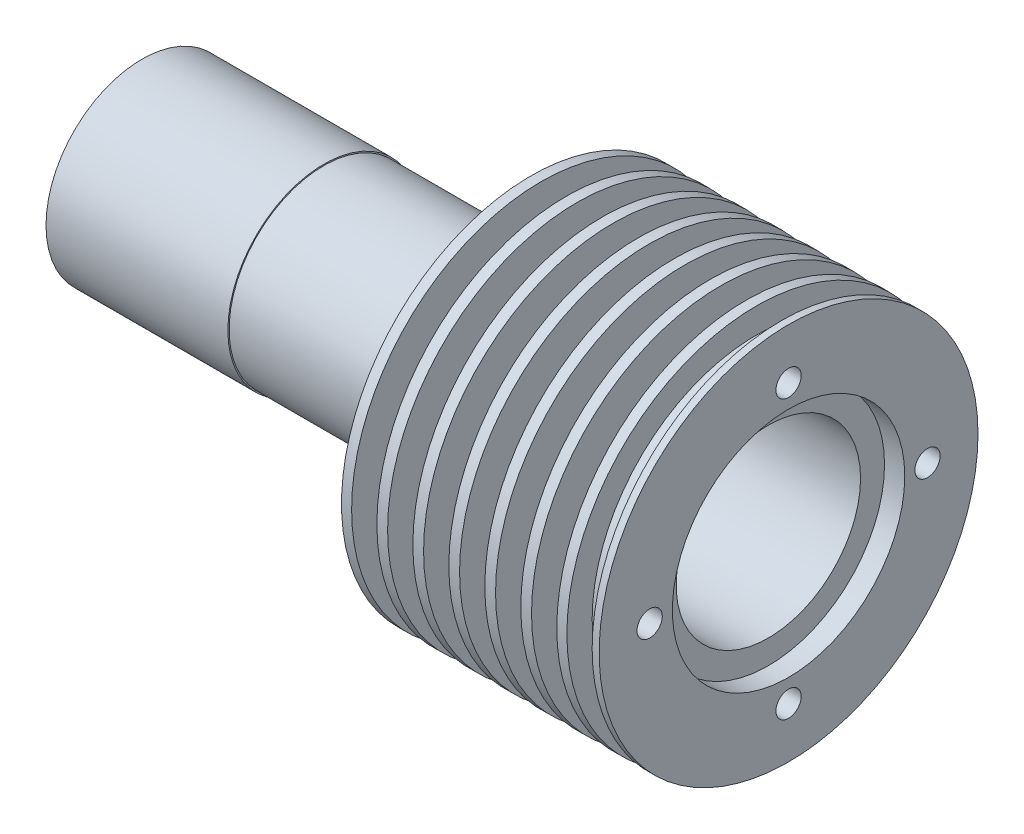
ISO-10303-21;
HEADER;
FILE_DESCRIPTION(('STEP AP214'),'2;1');
FILE_NAME('part.step','',(''),(''),'','','');
FILE_SCHEMA(('AUTOMOTIVE_DESIGN { 1 0 10303 214 1 1 1 1 }'));
ENDSEC;
DATA;
#1=APPLICATION_CONTEXT('core data for automotive mechanical design processes');
#2=APPLICATION_PROTOCOL_DEFINITION('international standard','automotive_design',2000,#1);
#3=PRODUCT_CONTEXT('',#1,'mechanical');
#4=PRODUCT('Part','Part','',(#3));
#5=PRODUCT_RELATED_PRODUCT_CATEGORY('part','',(#4));
#6=PRODUCT_DEFINITION_FORMATION('','',#4);
#7=PRODUCT_DEFINITION_CONTEXT('part definition',#1,'design');
#8=PRODUCT_DEFINITION('design','',#6,#7);
#9=PRODUCT_DEFINITION_SHAPE('','',#8);
#10=(LENGTH_UNIT() NAMED_UNIT(*) SI_UNIT(.MILLI.,.METRE.));
#11=(NAMED_UNIT(*) PLANE_ANGLE_UNIT() SI_UNIT($,.RADIAN.));
#12=(NAMED_UNIT(*) SI_UNIT($,.STERADIAN.) SOLID_ANGLE_UNIT());
#13=UNCERTAINTY_MEASURE_WITH_UNIT(LENGTH_MEASURE(1.E-05),#10,'distance_accuracy_value','');
#14=(GEOMETRIC_REPRESENTATION_CONTEXT(3) GLOBAL_UNCERTAINTY_ASSIGNED_CONTEXT((#13)) GLOBAL_UNIT_ASSIGNED_CONTEXT((#10,
#11,#12)) REPRESENTATION_CONTEXT('',''));
#15=CARTESIAN_POINT('',(0.,0.,0.));
#16=DIRECTION('',(0.,0.,1.));
#17=DIRECTION('',(1.,0.,0.));
#18=AXIS2_PLACEMENT_3D('',#15,#16,#17);
#19=CARTESIAN_POINT('',(0.,0.,0.));
#20=DIRECTION('',(1.,0.,0.));
#21=DIRECTION('',(0.,0.,-1.));
#22=AXIS2_PLACEMENT_3D('',#19,#20,#21);
#23=CYLINDRICAL_SURFACE('',#22,18.25);
#24=CARTESIAN_POINT('',(0.,0.,0.));
#25=DIRECTION('',(1.,0.,0.));
#26=DIRECTION('',(0.,0.,-1.));
#27=AXIS2_PLACEMENT_3D('',#24,#25,#26);
#28=CIRCLE('',#27,18.25);
#29=CARTESIAN_POINT('',(0.,0.,-18.25));
#30=VERTEX_POINT('',#29);
#31=EDGE_CURVE('E131',#30,#30,#28,.T.);
#32=ORIENTED_EDGE('',*,*,#31,.F.);
#33=EDGE_LOOP('',(#32));
#34=FACE_BOUND('',#33,.T.);
#35=CARTESIAN_POINT('',(124.,0.,0.));
#36=DIRECTION('',(1.,0.,0.));
#37=DIRECTION('',(0.,0.,-1.));
#38=AXIS2_PLACEMENT_3D('',#35,#36,#37);
#39=CIRCLE('',#38,18.25);
#40=CARTESIAN_POINT('',(124.,0.,-18.25));
#41=VERTEX_POINT('',#40);
#42=EDGE_CURVE('E35',#41,#41,#39,.F.);
#43=ORIENTED_EDGE('',*,*,#42,.F.);
#44=EDGE_LOOP('',(#43));
#45=FACE_BOUND('',#44,.T.);
#46=ADVANCED_FACE('F31',(#34,#45),#23,.F.);
#47=CARTESIAN_POINT('',(77.,0.,0.));
#48=DIRECTION('',(1.,0.,0.));
#49=DIRECTION('',(0.,0.,-1.));
#50=AXIS2_PLACEMENT_3D('',#47,#48,#49);
#51=CYLINDRICAL_SURFACE('',#50,37.5);
#52=CARTESIAN_POINT('',(77.,0.,0.));
#53=DIRECTION('',(1.,0.,0.));
#54=DIRECTION('',(0.,0.,-1.));
#55=AXIS2_PLACEMENT_3D('',#52,#53,#54);
#56=CIRCLE('',#55,37.5);
#57=CARTESIAN_POINT('',(77.,0.,-37.5));
#58=VERTEX_POINT('',#57);
#59=EDGE_CURVE('E136',#58,#58,#56,.T.);
#60=ORIENTED_EDGE('',*,*,#59,.T.);
#61=EDGE_LOOP('',(#60));
#62=FACE_BOUND('',#61,.T.);
#63=CARTESIAN_POINT('',(79.,0.,0.));
#64=DIRECTION('',(-1.,0.,0.));
#65=DIRECTION('',(0.,0.,1.));
#66=AXIS2_PLACEMENT_3D('',#63,#64,#65);
#67=CIRCLE('',#66,37.5);
#68=CARTESIAN_POINT('',(79.,0.,37.5));
#69=VERTEX_POINT('',#68);
#70=EDGE_CURVE('E120',#69,#69,#67,.T.);
#71=ORIENTED_EDGE('',*,*,#70,.T.);
#72=EDGE_LOOP('',(#71));
#73=FACE_BOUND('',#72,.T.);
#74=ADVANCED_FACE('F170',(#62,#73),#51,.T.);
#75=CARTESIAN_POINT('',(128.,0.,0.));
#76=DIRECTION('',(1.,0.,0.));
#77=DIRECTION('',(0.,0.,-1.));
#78=AXIS2_PLACEMENT_3D('',#75,#76,#77);
#79=CIRCLE('',#78,37.5);
#80=CARTESIAN_POINT('',(128.,0.,-37.5));
#81=VERTEX_POINT('',#80);
#82=EDGE_CURVE('E134',#81,#81,#79,.T.);
#83=ORIENTED_EDGE('',*,*,#82,.F.);
#84=EDGE_LOOP('',(#83));
#85=FACE_BOUND('',#84,.T.);
#86=CARTESIAN_POINT('',(126.614976083293,0.,0.));
#87=DIRECTION('',(-1.,0.,0.));
#88=DIRECTION('',(0.,0.,1.));
#89=AXIS2_PLACEMENT_3D('',#86,#87,#88);
#90=CIRCLE('',#89,37.5);
#91=CARTESIAN_POINT('',(126.614976083293,0.,37.5));
#92=VERTEX_POINT('',#91);
#93=EDGE_CURVE('E110',#92,#92,#90,.T.);
#94=ORIENTED_EDGE('',*,*,#93,.F.);
#95=EDGE_LOOP('',(#94));
#96=FACE_BOUND('',#95,.T.);
#97=ADVANCED_FACE('F177',(#85,#96),#51,.T.);
#98=CARTESIAN_POINT('',(128.,0.,0.));
#99=DIRECTION('',(-1.,0.,0.));
#100=DIRECTION('',(0.,0.,1.));
#101=AXIS2_PLACEMENT_3D('',#98,#99,#100);
#102=CYLINDRICAL_SURFACE('',#101,19.);
#103=CARTESIAN_POINT('',(72.,0.,0.));
#104=DIRECTION('',(1.,0.,0.));
#105=DIRECTION('',(0.,0.,-1.));
#106=AXIS2_PLACEMENT_3D('',#103,#104,#105);
#107=CIRCLE('',#106,19.);
#108=CARTESIAN_POINT('',(72.,0.,-19.));
#109=VERTEX_POINT('',#108);
#110=EDGE_CURVE('E139',#109,#109,#107,.T.);
#111=ORIENTED_EDGE('',*,*,#110,.T.);
#112=EDGE_LOOP('',(#111));
#113=FACE_BOUND('',#112,.T.);
#114=CARTESIAN_POINT('',(77.,0.,0.));
#115=DIRECTION('',(1.,0.,0.));
#116=DIRECTION('',(0.,0.,-1.));
#117=AXIS2_PLACEMENT_3D('',#114,#115,#116);
#118=CIRCLE('',#117,19.);
#119=CARTESIAN_POINT('',(77.,0.,-19.));
#120=VERTEX_POINT('',#119);
#121=EDGE_CURVE('E10',#120,#120,#118,.T.);
#122=ORIENTED_EDGE('',*,*,#121,.F.);
#123=EDGE_LOOP('',(#122));
#124=FACE_BOUND('',#123,.T.);
#125=ADVANCED_FACE('F199',(#113,#124),#102,.T.);
#126=CARTESIAN_POINT('',(36.,0.,0.));
#127=DIRECTION('',(-1.,0.,0.));
#128=DIRECTION('',(0.,0.,1.));
#129=AXIS2_PLACEMENT_3D('',#126,#127,#128);
#130=CYLINDRICAL_SURFACE('',#129,19.);
#131=CARTESIAN_POINT('',(36.,0.,0.));
#132=DIRECTION('',(1.,0.,0.));
#133=DIRECTION('',(0.,0.,-1.));
#134=AXIS2_PLACEMENT_3D('',#131,#132,#133);
#135=CIRCLE('',#134,19.);
#136=CARTESIAN_POINT('',(36.,0.,-19.));
#137=VERTEX_POINT('',#136);
#138=EDGE_CURVE('E44',#137,#137,#135,.T.);
#139=ORIENTED_EDGE('',*,*,#138,.F.);
#140=EDGE_LOOP('',(#139));
#141=FACE_BOUND('',#140,.T.);
#142=CARTESIAN_POINT('',(0.,0.,0.));
#143=DIRECTION('',(1.,0.,0.));
#144=DIRECTION('',(0.,0.,-1.));
#145=AXIS2_PLACEMENT_3D('',#142,#143,#144);
#146=CIRCLE('',#145,19.);
#147=CARTESIAN_POINT('',(0.,0.,-19.));
#148=VERTEX_POINT('',#147);
#149=EDGE_CURVE('E48',#148,#148,#146,.T.);
#150=ORIENTED_EDGE('',*,*,#149,.T.);
#151=EDGE_LOOP('',(#150));
#152=FACE_BOUND('',#151,.T.);
#153=ADVANCED_FACE('F33',(#141,#152),#130,.T.);
#154=CARTESIAN_POINT('',(36.,0.,0.));
#155=DIRECTION('',(1.,0.,0.));
#156=DIRECTION('',(0.,0.,-1.));
#157=AXIS2_PLACEMENT_3D('',#154,#155,#156);
#158=PLANE('',#157);
#159=CARTESIAN_POINT('',(36.,0.,0.));
#160=DIRECTION('',(1.,0.,0.));
#161=DIRECTION('',(0.,0.,-1.));
#162=AXIS2_PLACEMENT_3D('',#159,#160,#161);
#163=CIRCLE('',#162,18.75);
#164=CARTESIAN_POINT('',(36.,0.,-18.75));
#165=VERTEX_POINT('',#164);
#166=EDGE_CURVE('E39',#165,#165,#163,.T.);
#167=ORIENTED_EDGE('',*,*,#166,.F.);
#168=EDGE_LOOP('',(#167));
#169=FACE_BOUND('',#168,.T.);
#170=ORIENTED_EDGE('',*,*,#138,.T.);
#171=EDGE_LOOP('',(#170));
#172=FACE_BOUND('',#171,.T.);
#173=ADVANCED_FACE('F156',(#169,#172),#158,.T.);
#174=CARTESIAN_POINT('',(0.,0.,0.));
#175=DIRECTION('',(1.,0.,0.));
#176=DIRECTION('',(0.,0.,-1.));
#177=AXIS2_PLACEMENT_3D('',#174,#175,#176);
#178=PLANE('',#177);
#179=ORIENTED_EDGE('',*,*,#31,.T.);
#180=EDGE_LOOP('',(#179));
#181=FACE_BOUND('',#180,.T.);
#182=ORIENTED_EDGE('',*,*,#149,.F.);
#183=EDGE_LOOP('',(#182));
#184=FACE_BOUND('',#183,.T.);
#185=ADVANCED_FACE('F153',(#181,#184),#178,.F.);
#186=CARTESIAN_POINT('',(72.,0.,0.));
#187=DIRECTION('',(-1.,0.,0.));
#188=DIRECTION('',(0.,0.,1.));
#189=AXIS2_PLACEMENT_3D('',#186,#187,#188);
#190=CYLINDRICAL_SURFACE('',#189,18.75);
#191=CARTESIAN_POINT('',(72.,0.,0.));
#192=DIRECTION('',(1.,0.,0.));
#193=DIRECTION('',(0.,0.,-1.));
#194=AXIS2_PLACEMENT_3D('',#191,#192,#193);
#195=CIRCLE('',#194,18.75);
#196=CARTESIAN_POINT('',(72.,0.,-18.75));
#197=VERTEX_POINT('',#196);
#198=EDGE_CURVE('E144',#197,#197,#195,.T.);
#199=ORIENTED_EDGE('',*,*,#198,.F.);
#200=EDGE_LOOP('',(#199));
#201=FACE_BOUND('',#200,.T.);
#202=ORIENTED_EDGE('',*,*,#166,.T.);
#203=EDGE_LOOP('',(#202));
#204=FACE_BOUND('',#203,.T.);
#205=ADVANCED_FACE('F155',(#201,#204),#190,.T.);
#206=CARTESIAN_POINT('',(72.,0.,0.));
#207=DIRECTION('',(1.,0.,0.));
#208=DIRECTION('',(0.,0.,-1.));
#209=AXIS2_PLACEMENT_3D('',#206,#207,#208);
#210=PLANE('',#209);
#211=ORIENTED_EDGE('',*,*,#198,.T.);
#212=EDGE_LOOP('',(#211));
#213=FACE_BOUND('',#212,.T.);
#214=ORIENTED_EDGE('',*,*,#110,.F.);
#215=EDGE_LOOP('',(#214));
#216=FACE_BOUND('',#215,.T.);
#217=ADVANCED_FACE('F163',(#213,#216),#210,.F.);
#218=CARTESIAN_POINT('',(77.,0.,0.));
#219=DIRECTION('',(1.,0.,0.));
#220=DIRECTION('',(0.,0.,-1.));
#221=AXIS2_PLACEMENT_3D('',#218,#219,#220);
#222=PLANE('',#221);
#223=ORIENTED_EDGE('',*,*,#121,.T.);
#224=EDGE_LOOP('',(#223));
#225=FACE_BOUND('',#224,.T.);
#226=ORIENTED_EDGE('',*,*,#59,.F.);
#227=EDGE_LOOP('',(#226));
#228=FACE_BOUND('',#227,.T.);
#229=ADVANCED_FACE('F188',(#225,#228),#222,.F.);
#230=CARTESIAN_POINT('',(128.,0.,0.));
#231=DIRECTION('',(1.,0.,0.));
#232=DIRECTION('',(0.,0.,-1.));
#233=AXIS2_PLACEMENT_3D('',#230,#231,#232);
#234=PLANE('',#233);
#235=CARTESIAN_POINT('',(128.,0.,0.));
#236=DIRECTION('',(1.,0.,0.));
#237=DIRECTION('',(0.,0.,-1.));
#238=AXIS2_PLACEMENT_3D('',#235,#236,#237);
#239=CIRCLE('',#238,23.);
#240=CARTESIAN_POINT('',(128.,0.,-23.));
#241=VERTEX_POINT('',#240);
#242=EDGE_CURVE('E300',#241,#241,#239,.T.);
#243=ORIENTED_EDGE('',*,*,#242,.F.);
#244=EDGE_LOOP('',(#243));
#245=FACE_BOUND('',#244,.T.);
#246=CARTESIAN_POINT('',(128.,27.5,0.));
#247=DIRECTION('',(1.,0.,0.));
#248=DIRECTION('',(0.,0.,-1.));
#249=AXIS2_PLACEMENT_3D('',#246,#247,#248);
#250=CIRCLE('',#249,2.5);
#251=CARTESIAN_POINT('',(128.,27.5,-2.5));
#252=VERTEX_POINT('',#251);
#253=EDGE_CURVE('E54',#252,#252,#250,.T.);
#254=ORIENTED_EDGE('',*,*,#253,.F.);
#255=EDGE_LOOP('',(#254));
#256=FACE_BOUND('',#255,.T.);
#257=CARTESIAN_POINT('',(128.,0.,-27.5));
#258=DIRECTION('',(1.,0.,0.));
#259=DIRECTION('',(0.,0.,-1.));
#260=AXIS2_PLACEMENT_3D('',#257,#258,#259);
#261=CIRCLE('',#260,2.5);
#262=CARTESIAN_POINT('',(128.,0.,-30.));
#263=VERTEX_POINT('',#262);
#264=EDGE_CURVE('E295',#263,#263,#261,.T.);
#265=ORIENTED_EDGE('',*,*,#264,.F.);
#266=EDGE_LOOP('',(#265));
#267=FACE_BOUND('',#266,.T.);
#268=CARTESIAN_POINT('',(128.,-27.5,1.92031473636372E-13));
#269=DIRECTION('',(1.,0.,0.));
#270=DIRECTION('',(0.,0.,-1.));
#271=AXIS2_PLACEMENT_3D('',#268,#269,#270);
#272=CIRCLE('',#271,2.5);
#273=CARTESIAN_POINT('',(128.,-27.5,-2.49999999999981));
#274=VERTEX_POINT('',#273);
#275=EDGE_CURVE('E292',#274,#274,#272,.T.);
#276=ORIENTED_EDGE('',*,*,#275,.F.);
#277=EDGE_LOOP('',(#276));
#278=FACE_BOUND('',#277,.T.);
#279=CARTESIAN_POINT('',(128.,2.88047210454558E-13,27.5));
#280=DIRECTION('',(1.,0.,0.));
#281=DIRECTION('',(0.,0.,-1.));
#282=AXIS2_PLACEMENT_3D('',#279,#280,#281);
#283=CIRCLE('',#282,2.5);
#284=CARTESIAN_POINT('',(128.,2.88047210454558E-13,25.));
#285=VERTEX_POINT('',#284);
#286=EDGE_CURVE('E289',#285,#285,#283,.T.);
#287=ORIENTED_EDGE('',*,*,#286,.F.);
#288=EDGE_LOOP('',(#287));
#289=FACE_BOUND('',#288,.T.);
#290=ORIENTED_EDGE('',*,*,#82,.T.);
#291=EDGE_LOOP('',(#290));
#292=FACE_BOUND('',#291,.T.);
#293=ADVANCED_FACE('F190',(#245,#256,#267,#278,#289,#292),#234,.T.);
#294=CARTESIAN_POINT('',(121.614976083293,37.5,0.));
#295=DIRECTION('',(1.,0.,0.));
#296=DIRECTION('',(0.,0.,-1.));
#297=AXIS2_PLACEMENT_3D('',#294,#295,#296);
#298=PLANE('',#297);
#299=CARTESIAN_POINT('',(121.614976083293,0.,0.));
#300=DIRECTION('',(-1.,0.,0.));
#301=DIRECTION('',(0.,0.,1.));
#302=AXIS2_PLACEMENT_3D('',#299,#300,#301);
#303=CIRCLE('',#302,32.5);
#304=CARTESIAN_POINT('',(121.614976083293,0.,32.5));
#305=VERTEX_POINT('',#304);
#306=EDGE_CURVE('E117',#305,#305,#303,.T.);
#307=ORIENTED_EDGE('',*,*,#306,.T.);
#308=EDGE_LOOP('',(#307));
#309=FACE_BOUND('',#308,.T.);
#310=CARTESIAN_POINT('',(121.614976083293,0.,0.));
#311=DIRECTION('',(-1.,0.,0.));
#312=DIRECTION('',(0.,0.,1.));
#313=AXIS2_PLACEMENT_3D('',#310,#311,#312);
#314=CIRCLE('',#313,37.5);
#315=CARTESIAN_POINT('',(121.614976083293,0.,37.5));
#316=VERTEX_POINT('',#315);
#317=EDGE_CURVE('E107',#316,#316,#314,.T.);
#318=ORIENTED_EDGE('',*,*,#317,.F.);
#319=EDGE_LOOP('',(#318));
#320=FACE_BOUND('',#319,.T.);
#321=ADVANCED_FACE('F194',(#309,#320),#298,.T.);
#322=CARTESIAN_POINT('',(0.,0.,0.));
#323=DIRECTION('',(-1.,0.,0.));
#324=DIRECTION('',(0.,0.,1.));
#325=AXIS2_PLACEMENT_3D('',#322,#323,#324);
#326=CYLINDRICAL_SURFACE('',#325,32.5);
#327=CARTESIAN_POINT('',(126.614976083293,0.,0.));
#328=DIRECTION('',(-1.,0.,0.));
#329=DIRECTION('',(0.,0.,1.));
#330=AXIS2_PLACEMENT_3D('',#327,#328,#329);
#331=CIRCLE('',#330,32.5);
#332=CARTESIAN_POINT('',(126.614976083293,0.,32.5));
#333=VERTEX_POINT('',#332);
#334=EDGE_CURVE('E114',#333,#333,#331,.T.);
#335=ORIENTED_EDGE('',*,*,#334,.T.);
#336=EDGE_LOOP('',(#335));
#337=FACE_BOUND('',#336,.T.);
#338=ORIENTED_EDGE('',*,*,#306,.F.);
#339=EDGE_LOOP('',(#338));
#340=FACE_BOUND('',#339,.T.);
#341=ADVANCED_FACE('F254',(#337,#340),#326,.T.);
#342=CARTESIAN_POINT('',(126.614976083293,37.5,0.));
#343=DIRECTION('',(-1.,0.,0.));
#344=DIRECTION('',(0.,0.,1.));
#345=AXIS2_PLACEMENT_3D('',#342,#343,#344);
#346=PLANE('',#345);
#347=ORIENTED_EDGE('',*,*,#93,.T.);
#348=EDGE_LOOP('',(#347));
#349=FACE_BOUND('',#348,.T.);
#350=ORIENTED_EDGE('',*,*,#334,.F.);
#351=EDGE_LOOP('',(#350));
#352=FACE_BOUND('',#351,.T.);
#353=ADVANCED_FACE('F242',(#349,#352),#346,.T.);
#354=ORIENTED_EDGE('',*,*,#317,.T.);
#355=EDGE_LOOP('',(#354));
#356=FACE_BOUND('',#355,.T.);
#357=CARTESIAN_POINT('',(119.614976083293,0.,0.));
#358=DIRECTION('',(-1.,0.,0.));
#359=DIRECTION('',(0.,0.,1.));
#360=AXIS2_PLACEMENT_3D('',#357,#358,#359);
#361=CIRCLE('',#360,37.5);
#362=CARTESIAN_POINT('',(119.614976083293,0.,37.5));
#363=VERTEX_POINT('',#362);
#364=EDGE_CURVE('E65',#363,#363,#361,.T.);
#365=ORIENTED_EDGE('',*,*,#364,.F.);
#366=EDGE_LOOP('',(#365));
#367=FACE_BOUND('',#366,.T.);
#368=ADVANCED_FACE('F225',(#356,#367),#51,.T.);
#369=CARTESIAN_POINT('',(114.614976083293,37.5,0.));
#370=DIRECTION('',(1.,0.,0.));
#371=DIRECTION('',(0.,0.,-1.));
#372=AXIS2_PLACEMENT_3D('',#369,#370,#371);
#373=PLANE('',#372);
#374=CARTESIAN_POINT('',(114.614976083293,0.,0.));
#375=DIRECTION('',(-1.,0.,0.));
#376=DIRECTION('',(0.,0.,1.));
#377=AXIS2_PLACEMENT_3D('',#374,#375,#376);
#378=CIRCLE('',#377,19.);
#379=CARTESIAN_POINT('',(114.614976083293,0.,19.));
#380=VERTEX_POINT('',#379);
#381=EDGE_CURVE('E78',#380,#380,#378,.T.);
#382=ORIENTED_EDGE('',*,*,#381,.T.);
#383=EDGE_LOOP('',(#382));
#384=FACE_BOUND('',#383,.T.);
#385=CARTESIAN_POINT('',(114.614976083293,0.,0.));
#386=DIRECTION('',(-1.,0.,0.));
#387=DIRECTION('',(0.,0.,1.));
#388=AXIS2_PLACEMENT_3D('',#385,#386,#387);
#389=CIRCLE('',#388,37.5);
#390=CARTESIAN_POINT('',(114.614976083293,0.,37.5));
#391=VERTEX_POINT('',#390);
#392=EDGE_CURVE('E61',#391,#391,#389,.T.);
#393=ORIENTED_EDGE('',*,*,#392,.F.);
#394=EDGE_LOOP('',(#393));
#395=FACE_BOUND('',#394,.T.);
#396=ADVANCED_FACE('F241',(#384,#395),#373,.T.);
#397=CARTESIAN_POINT('',(0.,0.,0.));
#398=DIRECTION('',(-1.,0.,0.));
#399=DIRECTION('',(0.,0.,1.));
#400=AXIS2_PLACEMENT_3D('',#397,#398,#399);
#401=CYLINDRICAL_SURFACE('',#400,19.);
#402=CARTESIAN_POINT('',(119.614976083293,0.,0.));
#403=DIRECTION('',(-1.,0.,0.));
#404=DIRECTION('',(0.,0.,1.));
#405=AXIS2_PLACEMENT_3D('',#402,#403,#404);
#406=CIRCLE('',#405,19.);
#407=CARTESIAN_POINT('',(119.614976083293,0.,19.));
#408=VERTEX_POINT('',#407);
#409=EDGE_CURVE('E70',#408,#408,#406,.T.);
#410=ORIENTED_EDGE('',*,*,#409,.T.);
#411=EDGE_LOOP('',(#410));
#412=FACE_BOUND('',#411,.T.);
#413=ORIENTED_EDGE('',*,*,#381,.F.);
#414=EDGE_LOOP('',(#413));
#415=FACE_BOUND('',#414,.T.);
#416=ADVANCED_FACE('F250',(#412,#415),#401,.T.);
#417=CARTESIAN_POINT('',(119.614976083293,37.5,0.));
#418=DIRECTION('',(-1.,0.,0.));
#419=DIRECTION('',(0.,0.,1.));
#420=AXIS2_PLACEMENT_3D('',#417,#418,#419);
#421=PLANE('',#420);
#422=CARTESIAN_POINT('',(119.614976083293,27.5,0.));
#423=DIRECTION('',(-1.,0.,0.));
#424=DIRECTION('',(0.,0.,1.));
#425=AXIS2_PLACEMENT_3D('',#422,#423,#424);
#426=CIRCLE('',#425,2.5);
#427=CARTESIAN_POINT('',(119.614976083293,27.5,2.5));
#428=VERTEX_POINT('',#427);
#429=EDGE_CURVE('E59',#428,#428,#426,.T.);
#430=ORIENTED_EDGE('',*,*,#429,.F.);
#431=EDGE_LOOP('',(#430));
#432=FACE_BOUND('',#431,.T.);
#433=CARTESIAN_POINT('',(119.614976083293,0.,-27.5));
#434=DIRECTION('',(-1.,0.,0.));
#435=DIRECTION('',(0.,0.,1.));
#436=AXIS2_PLACEMENT_3D('',#433,#434,#435);
#437=CIRCLE('',#436,2.5);
#438=CARTESIAN_POINT('',(119.614976083293,0.,-25.));
#439=VERTEX_POINT('',#438);
#440=EDGE_CURVE('E57',#439,#439,#437,.T.);
#441=ORIENTED_EDGE('',*,*,#440,.F.);
#442=EDGE_LOOP('',(#441));
#443=FACE_BOUND('',#442,.T.);
#444=CARTESIAN_POINT('',(119.614976083293,-27.5,1.92031473636372E-13));
#445=DIRECTION('',(-1.,0.,0.));
#446=DIRECTION('',(0.,0.,1.));
#447=AXIS2_PLACEMENT_3D('',#444,#445,#446);
#448=CIRCLE('',#447,2.5);
#449=CARTESIAN_POINT('',(119.614976083293,-27.5,2.50000000000019));
#450=VERTEX_POINT('',#449);
#451=EDGE_CURVE('E53',#450,#450,#448,.T.);
#452=ORIENTED_EDGE('',*,*,#451,.F.);
#453=EDGE_LOOP('',(#452));
#454=FACE_BOUND('',#453,.T.);
#455=CARTESIAN_POINT('',(119.614976083293,2.88047210454558E-13,27.5));
#456=DIRECTION('',(-1.,0.,0.));
#457=DIRECTION('',(0.,0.,1.));
#458=AXIS2_PLACEMENT_3D('',#455,#456,#457);
#459=CIRCLE('',#458,2.5);
#460=CARTESIAN_POINT('',(119.614976083293,2.88047210454558E-13,30.));
#461=VERTEX_POINT('',#460);
#462=EDGE_CURVE('E50',#461,#461,#459,.T.);
#463=ORIENTED_EDGE('',*,*,#462,.F.);
#464=EDGE_LOOP('',(#463));
#465=FACE_BOUND('',#464,.T.);
#466=ORIENTED_EDGE('',*,*,#364,.T.);
#467=EDGE_LOOP('',(#466));
#468=FACE_BOUND('',#467,.T.);
#469=ORIENTED_EDGE('',*,*,#409,.F.);
#470=EDGE_LOOP('',(#469));
#471=FACE_BOUND('',#470,.T.);
#472=ADVANCED_FACE('F345',(#432,#443,#454,#465,#468,#471),#421,.T.);
#473=CARTESIAN_POINT('',(79.,37.5,0.));
#474=DIRECTION('',(1.,0.,0.));
#475=DIRECTION('',(0.,0.,-1.));
#476=AXIS2_PLACEMENT_3D('',#473,#474,#475);
#477=PLANE('',#476);
#478=CARTESIAN_POINT('',(79.,0.,0.));
#479=DIRECTION('',(-1.,0.,0.));
#480=DIRECTION('',(0.,0.,1.));
#481=AXIS2_PLACEMENT_3D('',#478,#479,#480);
#482=CIRCLE('',#481,19.);
#483=CARTESIAN_POINT('',(79.,0.,19.));
#484=VERTEX_POINT('',#483);
#485=EDGE_CURVE('E135',#484,#484,#482,.T.);
#486=ORIENTED_EDGE('',*,*,#485,.T.);
#487=EDGE_LOOP('',(#486));
#488=FACE_BOUND('',#487,.T.);
#489=ORIENTED_EDGE('',*,*,#70,.F.);
#490=EDGE_LOOP('',(#489));
#491=FACE_BOUND('',#490,.T.);
#492=ADVANCED_FACE('F342',(#488,#491),#477,.T.);
#493=CARTESIAN_POINT('',(0.,0.,0.));
#494=DIRECTION('',(-1.,0.,0.));
#495=DIRECTION('',(0.,0.,1.));
#496=AXIS2_PLACEMENT_3D('',#493,#494,#495);
#497=CYLINDRICAL_SURFACE('',#496,19.);
#498=CARTESIAN_POINT('',(84.,0.,0.));
#499=DIRECTION('',(-1.,0.,0.));
#500=DIRECTION('',(0.,0.,1.));
#501=AXIS2_PLACEMENT_3D('',#498,#499,#500);
#502=CIRCLE('',#501,19.);
#503=CARTESIAN_POINT('',(84.,0.,19.));
#504=VERTEX_POINT('',#503);
#505=EDGE_CURVE('E281',#504,#504,#502,.T.);
#506=ORIENTED_EDGE('',*,*,#505,.T.);
#507=EDGE_LOOP('',(#506));
#508=FACE_BOUND('',#507,.T.);
#509=ORIENTED_EDGE('',*,*,#485,.F.);
#510=EDGE_LOOP('',(#509));
#511=FACE_BOUND('',#510,.T.);
#512=ADVANCED_FACE('F338',(#508,#511),#497,.T.);
#513=CARTESIAN_POINT('',(84.,37.5,0.));
#514=DIRECTION('',(-1.,0.,0.));
#515=DIRECTION('',(0.,0.,1.));
#516=AXIS2_PLACEMENT_3D('',#513,#514,#515);
#517=PLANE('',#516);
#518=CARTESIAN_POINT('',(84.,0.,0.));
#519=DIRECTION('',(-1.,0.,0.));
#520=DIRECTION('',(0.,0.,1.));
#521=AXIS2_PLACEMENT_3D('',#518,#519,#520);
#522=CIRCLE('',#521,37.5);
#523=CARTESIAN_POINT('',(84.,0.,37.5));
#524=VERTEX_POINT('',#523);
#525=EDGE_CURVE('E284',#524,#524,#522,.T.);
#526=ORIENTED_EDGE('',*,*,#525,.T.);
#527=EDGE_LOOP('',(#526));
#528=FACE_BOUND('',#527,.T.);
#529=ORIENTED_EDGE('',*,*,#505,.F.);
#530=EDGE_LOOP('',(#529));
#531=FACE_BOUND('',#530,.T.);
#532=ADVANCED_FACE('F268',(#528,#531),#517,.T.);
#533=CARTESIAN_POINT('',(86.1229952166586,0.,0.));
#534=DIRECTION('',(-1.,0.,0.));
#535=DIRECTION('',(0.,0.,1.));
#536=AXIS2_PLACEMENT_3D('',#533,#534,#535);
#537=CIRCLE('',#536,37.5);
#538=CARTESIAN_POINT('',(86.1229952166586,0.,37.5));
#539=VERTEX_POINT('',#538);
#540=EDGE_CURVE('E95',#539,#539,#537,.T.);
#541=ORIENTED_EDGE('',*,*,#540,.T.);
#542=EDGE_LOOP('',(#541));
#543=FACE_BOUND('',#542,.T.);
#544=ORIENTED_EDGE('',*,*,#525,.F.);
#545=EDGE_LOOP('',(#544));
#546=FACE_BOUND('',#545,.T.);
#547=ADVANCED_FACE('F180',(#543,#546),#51,.T.);
#548=CARTESIAN_POINT('',(112.491980866634,0.,0.));
#549=DIRECTION('',(-1.,0.,0.));
#550=DIRECTION('',(0.,0.,1.));
#551=AXIS2_PLACEMENT_3D('',#548,#549,#550);
#552=CIRCLE('',#551,37.5);
#553=CARTESIAN_POINT('',(112.491980866634,0.,37.5));
#554=VERTEX_POINT('',#553);
#555=EDGE_CURVE('E272',#554,#554,#552,.T.);
#556=ORIENTED_EDGE('',*,*,#555,.F.);
#557=EDGE_LOOP('',(#556));
#558=FACE_BOUND('',#557,.T.);
#559=ORIENTED_EDGE('',*,*,#392,.T.);
#560=EDGE_LOOP('',(#559));
#561=FACE_BOUND('',#560,.T.);
#562=ADVANCED_FACE('F244',(#558,#561),#51,.T.);
#563=CARTESIAN_POINT('',(107.491980866634,37.5,0.));
#564=DIRECTION('',(1.,0.,0.));
#565=DIRECTION('',(0.,0.,-1.));
#566=AXIS2_PLACEMENT_3D('',#563,#564,#565);
#567=PLANE('',#566);
#568=CARTESIAN_POINT('',(107.491980866634,0.,0.));
#569=DIRECTION('',(-1.,0.,0.));
#570=DIRECTION('',(0.,0.,1.));
#571=AXIS2_PLACEMENT_3D('',#568,#569,#570);
#572=CIRCLE('',#571,19.);
#573=CARTESIAN_POINT('',(107.491980866634,0.,19.));
#574=VERTEX_POINT('',#573);
#575=EDGE_CURVE('E73',#574,#574,#572,.T.);
#576=ORIENTED_EDGE('',*,*,#575,.T.);
#577=EDGE_LOOP('',(#576));
#578=FACE_BOUND('',#577,.T.);
#579=CARTESIAN_POINT('',(107.491980866634,0.,0.));
#580=DIRECTION('',(-1.,0.,0.));
#581=DIRECTION('',(0.,0.,1.));
#582=AXIS2_PLACEMENT_3D('',#579,#580,#581);
#583=CIRCLE('',#582,37.5);
#584=CARTESIAN_POINT('',(107.491980866634,0.,37.5));
#585=VERTEX_POINT('',#584);
#586=EDGE_CURVE('E81',#585,#585,#583,.T.);
#587=ORIENTED_EDGE('',*,*,#586,.F.);
#588=EDGE_LOOP('',(#587));
#589=FACE_BOUND('',#588,.T.);
#590=ADVANCED_FACE('F259',(#578,#589),#567,.T.);
#591=CARTESIAN_POINT('',(0.,0.,0.));
#592=DIRECTION('',(-1.,0.,0.));
#593=DIRECTION('',(0.,0.,1.));
#594=AXIS2_PLACEMENT_3D('',#591,#592,#593);
#595=CYLINDRICAL_SURFACE('',#594,19.);
#596=CARTESIAN_POINT('',(112.491980866634,0.,0.));
#597=DIRECTION('',(-1.,0.,0.));
#598=DIRECTION('',(0.,0.,1.));
#599=AXIS2_PLACEMENT_3D('',#596,#597,#598);
#600=CIRCLE('',#599,19.);
#601=CARTESIAN_POINT('',(112.491980866634,0.,19.));
#602=VERTEX_POINT('',#601);
#603=EDGE_CURVE('E273',#602,#602,#600,.T.);
#604=ORIENTED_EDGE('',*,*,#603,.T.);
#605=EDGE_LOOP('',(#604));
#606=FACE_BOUND('',#605,.T.);
#607=ORIENTED_EDGE('',*,*,#575,.F.);
#608=EDGE_LOOP('',(#607));
#609=FACE_BOUND('',#608,.T.);
#610=ADVANCED_FACE('F235',(#606,#609),#595,.T.);
#611=CARTESIAN_POINT('',(112.491980866634,37.5,0.));
#612=DIRECTION('',(-1.,0.,0.));
#613=DIRECTION('',(0.,0.,1.));
#614=AXIS2_PLACEMENT_3D('',#611,#612,#613);
#615=PLANE('',#614);
#616=ORIENTED_EDGE('',*,*,#555,.T.);
#617=EDGE_LOOP('',(#616));
#618=FACE_BOUND('',#617,.T.);
#619=ORIENTED_EDGE('',*,*,#603,.F.);
#620=EDGE_LOOP('',(#619));
#621=FACE_BOUND('',#620,.T.);
#622=ADVANCED_FACE('F223',(#618,#621),#615,.T.);
#623=CARTESIAN_POINT('',(105.368985649976,0.,0.));
#624=DIRECTION('',(-1.,0.,0.));
#625=DIRECTION('',(0.,0.,1.));
#626=AXIS2_PLACEMENT_3D('',#623,#624,#625);
#627=CIRCLE('',#626,37.5);
#628=CARTESIAN_POINT('',(105.368985649976,0.,37.5));
#629=VERTEX_POINT('',#628);
#630=EDGE_CURVE('E99',#629,#629,#627,.T.);
#631=ORIENTED_EDGE('',*,*,#630,.F.);
#632=EDGE_LOOP('',(#631));
#633=FACE_BOUND('',#632,.T.);
#634=ORIENTED_EDGE('',*,*,#586,.T.);
#635=EDGE_LOOP('',(#634));
#636=FACE_BOUND('',#635,.T.);
#637=ADVANCED_FACE('F209',(#633,#636),#51,.T.);
#638=CARTESIAN_POINT('',(100.368985649976,37.5,0.));
#639=DIRECTION('',(1.,0.,0.));
#640=DIRECTION('',(0.,0.,-1.));
#641=AXIS2_PLACEMENT_3D('',#638,#639,#640);
#642=PLANE('',#641);
#643=CARTESIAN_POINT('',(100.368985649976,0.,0.));
#644=DIRECTION('',(-1.,0.,0.));
#645=DIRECTION('',(0.,0.,1.));
#646=AXIS2_PLACEMENT_3D('',#643,#644,#645);
#647=CIRCLE('',#646,19.);
#648=CARTESIAN_POINT('',(100.368985649976,0.,19.));
#649=VERTEX_POINT('',#648);
#650=EDGE_CURVE('E86',#649,#649,#647,.T.);
#651=ORIENTED_EDGE('',*,*,#650,.T.);
#652=EDGE_LOOP('',(#651));
#653=FACE_BOUND('',#652,.T.);
#654=CARTESIAN_POINT('',(100.368985649976,0.,0.));
#655=DIRECTION('',(-1.,0.,0.));
#656=DIRECTION('',(0.,0.,1.));
#657=AXIS2_PLACEMENT_3D('',#654,#655,#656);
#658=CIRCLE('',#657,37.5);
#659=CARTESIAN_POINT('',(100.368985649976,0.,37.5));
#660=VERTEX_POINT('',#659);
#661=EDGE_CURVE('E96',#660,#660,#658,.T.);
#662=ORIENTED_EDGE('',*,*,#661,.F.);
#663=EDGE_LOOP('',(#662));
#664=FACE_BOUND('',#663,.T.);
#665=ADVANCED_FACE('F222',(#653,#664),#642,.T.);
#666=CARTESIAN_POINT('',(0.,0.,0.));
#667=DIRECTION('',(-1.,0.,0.));
#668=DIRECTION('',(0.,0.,1.));
#669=AXIS2_PLACEMENT_3D('',#666,#667,#668);
#670=CYLINDRICAL_SURFACE('',#669,19.);
#671=CARTESIAN_POINT('',(105.368985649976,0.,0.));
#672=DIRECTION('',(-1.,0.,0.));
#673=DIRECTION('',(0.,0.,1.));
#674=AXIS2_PLACEMENT_3D('',#671,#672,#673);
#675=CIRCLE('',#674,19.);
#676=CARTESIAN_POINT('',(105.368985649976,0.,19.));
#677=VERTEX_POINT('',#676);
#678=EDGE_CURVE('E102',#677,#677,#675,.T.);
#679=ORIENTED_EDGE('',*,*,#678,.T.);
#680=EDGE_LOOP('',(#679));
#681=FACE_BOUND('',#680,.T.);
#682=ORIENTED_EDGE('',*,*,#650,.F.);
#683=EDGE_LOOP('',(#682));
#684=FACE_BOUND('',#683,.T.);
#685=ADVANCED_FACE('F231',(#681,#684),#670,.T.);
#686=CARTESIAN_POINT('',(105.368985649976,37.5,0.));
#687=DIRECTION('',(-1.,0.,0.));
#688=DIRECTION('',(0.,0.,1.));
#689=AXIS2_PLACEMENT_3D('',#686,#687,#688);
#690=PLANE('',#689);
#691=ORIENTED_EDGE('',*,*,#630,.T.);
#692=EDGE_LOOP('',(#691));
#693=FACE_BOUND('',#692,.T.);
#694=ORIENTED_EDGE('',*,*,#678,.F.);
#695=EDGE_LOOP('',(#694));
#696=FACE_BOUND('',#695,.T.);
#697=ADVANCED_FACE('F368',(#693,#696),#690,.T.);
#698=ORIENTED_EDGE('',*,*,#661,.T.);
#699=EDGE_LOOP('',(#698));
#700=FACE_BOUND('',#699,.T.);
#701=CARTESIAN_POINT('',(98.2459904333171,0.,0.));
#702=DIRECTION('',(-1.,0.,0.));
#703=DIRECTION('',(0.,0.,1.));
#704=AXIS2_PLACEMENT_3D('',#701,#702,#703);
#705=CIRCLE('',#704,37.5);
#706=CARTESIAN_POINT('',(98.2459904333171,0.,37.5));
#707=VERTEX_POINT('',#706);
#708=EDGE_CURVE('E85',#707,#707,#705,.T.);
#709=ORIENTED_EDGE('',*,*,#708,.F.);
#710=EDGE_LOOP('',(#709));
#711=FACE_BOUND('',#710,.T.);
#712=ADVANCED_FACE('F181',(#700,#711),#51,.T.);
#713=CARTESIAN_POINT('',(93.2459904333171,37.5,0.));
#714=DIRECTION('',(1.,0.,0.));
#715=DIRECTION('',(0.,0.,-1.));
#716=AXIS2_PLACEMENT_3D('',#713,#714,#715);
#717=PLANE('',#716);
#718=CARTESIAN_POINT('',(93.2459904333171,0.,0.));
#719=DIRECTION('',(-1.,0.,0.));
#720=DIRECTION('',(0.,0.,1.));
#721=AXIS2_PLACEMENT_3D('',#718,#719,#720);
#722=CIRCLE('',#721,19.);
#723=CARTESIAN_POINT('',(93.2459904333171,0.,19.));
#724=VERTEX_POINT('',#723);
#725=EDGE_CURVE('E92',#724,#724,#722,.T.);
#726=ORIENTED_EDGE('',*,*,#725,.T.);
#727=EDGE_LOOP('',(#726));
#728=FACE_BOUND('',#727,.T.);
#729=CARTESIAN_POINT('',(93.2459904333171,0.,0.));
#730=DIRECTION('',(-1.,0.,0.));
#731=DIRECTION('',(0.,0.,1.));
#732=AXIS2_PLACEMENT_3D('',#729,#730,#731);
#733=CIRCLE('',#732,37.5);
#734=CARTESIAN_POINT('',(93.2459904333171,0.,37.5));
#735=VERTEX_POINT('',#734);
#736=EDGE_CURVE('E82',#735,#735,#733,.T.);
#737=ORIENTED_EDGE('',*,*,#736,.F.);
#738=EDGE_LOOP('',(#737));
#739=FACE_BOUND('',#738,.T.);
#740=ADVANCED_FACE('F363',(#728,#739),#717,.T.);
#741=CARTESIAN_POINT('',(0.,0.,0.));
#742=DIRECTION('',(-1.,0.,0.));
#743=DIRECTION('',(0.,0.,1.));
#744=AXIS2_PLACEMENT_3D('',#741,#742,#743);
#745=CYLINDRICAL_SURFACE('',#744,19.);
#746=CARTESIAN_POINT('',(98.2459904333171,0.,0.));
#747=DIRECTION('',(-1.,0.,0.));
#748=DIRECTION('',(0.,0.,1.));
#749=AXIS2_PLACEMENT_3D('',#746,#747,#748);
#750=CIRCLE('',#749,19.);
#751=CARTESIAN_POINT('',(98.2459904333171,0.,19.));
#752=VERTEX_POINT('',#751);
#753=EDGE_CURVE('E89',#752,#752,#750,.T.);
#754=ORIENTED_EDGE('',*,*,#753,.T.);
#755=EDGE_LOOP('',(#754));
#756=FACE_BOUND('',#755,.T.);
#757=ORIENTED_EDGE('',*,*,#725,.F.);
#758=EDGE_LOOP('',(#757));
#759=FACE_BOUND('',#758,.T.);
#760=ADVANCED_FACE('F359',(#756,#759),#745,.T.);
#761=CARTESIAN_POINT('',(98.2459904333171,37.5,0.));
#762=DIRECTION('',(-1.,0.,0.));
#763=DIRECTION('',(0.,0.,1.));
#764=AXIS2_PLACEMENT_3D('',#761,#762,#763);
#765=PLANE('',#764);
#766=ORIENTED_EDGE('',*,*,#708,.T.);
#767=EDGE_LOOP('',(#766));
#768=FACE_BOUND('',#767,.T.);
#769=ORIENTED_EDGE('',*,*,#753,.F.);
#770=EDGE_LOOP('',(#769));
#771=FACE_BOUND('',#770,.T.);
#772=ADVANCED_FACE('F219',(#768,#771),#765,.T.);
#773=ORIENTED_EDGE('',*,*,#736,.T.);
#774=EDGE_LOOP('',(#773));
#775=FACE_BOUND('',#774,.T.);
#776=CARTESIAN_POINT('',(91.1229952166586,0.,0.));
#777=DIRECTION('',(-1.,0.,0.));
#778=DIRECTION('',(0.,0.,1.));
#779=AXIS2_PLACEMENT_3D('',#776,#777,#778);
#780=CIRCLE('',#779,37.5);
#781=CARTESIAN_POINT('',(91.1229952166586,0.,37.5));
#782=VERTEX_POINT('',#781);
#783=EDGE_CURVE('E123',#782,#782,#780,.T.);
#784=ORIENTED_EDGE('',*,*,#783,.F.);
#785=EDGE_LOOP('',(#784));
#786=FACE_BOUND('',#785,.T.);
#787=ADVANCED_FACE('F208',(#775,#786),#51,.T.);
#788=CARTESIAN_POINT('',(86.1229952166586,37.5,0.));
#789=DIRECTION('',(1.,0.,0.));
#790=DIRECTION('',(0.,0.,-1.));
#791=AXIS2_PLACEMENT_3D('',#788,#789,#790);
#792=PLANE('',#791);
#793=CARTESIAN_POINT('',(86.1229952166586,0.,0.));
#794=DIRECTION('',(-1.,0.,0.));
#795=DIRECTION('',(0.,0.,1.));
#796=AXIS2_PLACEMENT_3D('',#793,#794,#795);
#797=CIRCLE('',#796,19.);
#798=CARTESIAN_POINT('',(86.1229952166586,0.,19.));
#799=VERTEX_POINT('',#798);
#800=EDGE_CURVE('E111',#799,#799,#797,.T.);
#801=ORIENTED_EDGE('',*,*,#800,.T.);
#802=EDGE_LOOP('',(#801));
#803=FACE_BOUND('',#802,.T.);
#804=ORIENTED_EDGE('',*,*,#540,.F.);
#805=EDGE_LOOP('',(#804));
#806=FACE_BOUND('',#805,.T.);
#807=ADVANCED_FACE('F186',(#803,#806),#792,.T.);
#808=CARTESIAN_POINT('',(0.,0.,0.));
#809=DIRECTION('',(-1.,0.,0.));
#810=DIRECTION('',(0.,0.,1.));
#811=AXIS2_PLACEMENT_3D('',#808,#809,#810);
#812=CYLINDRICAL_SURFACE('',#811,19.);
#813=CARTESIAN_POINT('',(91.1229952166586,0.,0.));
#814=DIRECTION('',(-1.,0.,0.));
#815=DIRECTION('',(0.,0.,1.));
#816=AXIS2_PLACEMENT_3D('',#813,#814,#815);
#817=CIRCLE('',#816,19.);
#818=CARTESIAN_POINT('',(91.1229952166586,0.,19.));
#819=VERTEX_POINT('',#818);
#820=EDGE_CURVE('E126',#819,#819,#817,.T.);
#821=ORIENTED_EDGE('',*,*,#820,.T.);
#822=EDGE_LOOP('',(#821));
#823=FACE_BOUND('',#822,.T.);
#824=ORIENTED_EDGE('',*,*,#800,.F.);
#825=EDGE_LOOP('',(#824));
#826=FACE_BOUND('',#825,.T.);
#827=ADVANCED_FACE('F381',(#823,#826),#812,.T.);
#828=CARTESIAN_POINT('',(91.1229952166586,37.5,0.));
#829=DIRECTION('',(-1.,0.,0.));
#830=DIRECTION('',(0.,0.,1.));
#831=AXIS2_PLACEMENT_3D('',#828,#829,#830);
#832=PLANE('',#831);
#833=ORIENTED_EDGE('',*,*,#783,.T.);
#834=EDGE_LOOP('',(#833));
#835=FACE_BOUND('',#834,.T.);
#836=ORIENTED_EDGE('',*,*,#820,.F.);
#837=EDGE_LOOP('',(#836));
#838=FACE_BOUND('',#837,.T.);
#839=ADVANCED_FACE('F334',(#835,#838),#832,.T.);
#840=CARTESIAN_POINT('',(119.,2.88047210454558E-13,27.5));
#841=DIRECTION('',(1.,0.,0.));
#842=DIRECTION('',(0.,0.,-1.));
#843=AXIS2_PLACEMENT_3D('',#840,#841,#842);
#844=CYLINDRICAL_SURFACE('',#843,2.5);
#845=ORIENTED_EDGE('',*,*,#462,.T.);
#846=EDGE_LOOP('',(#845));
#847=FACE_BOUND('',#846,.T.);
#848=ORIENTED_EDGE('',*,*,#286,.T.);
#849=EDGE_LOOP('',(#848));
#850=FACE_BOUND('',#849,.T.);
#851=ADVANCED_FACE('F330',(#847,#850),#844,.F.);
#852=CARTESIAN_POINT('',(119.,-27.5,1.92031473636372E-13));
#853=DIRECTION('',(1.,0.,0.));
#854=DIRECTION('',(0.,0.,-1.));
#855=AXIS2_PLACEMENT_3D('',#852,#853,#854);
#856=CYLINDRICAL_SURFACE('',#855,2.5);
#857=ORIENTED_EDGE('',*,*,#451,.T.);
#858=EDGE_LOOP('',(#857));
#859=FACE_BOUND('',#858,.T.);
#860=ORIENTED_EDGE('',*,*,#275,.T.);
#861=EDGE_LOOP('',(#860));
#862=FACE_BOUND('',#861,.T.);
#863=ADVANCED_FACE('F326',(#859,#862),#856,.F.);
#864=CARTESIAN_POINT('',(119.,0.,-27.5));
#865=DIRECTION('',(1.,0.,0.));
#866=DIRECTION('',(0.,0.,-1.));
#867=AXIS2_PLACEMENT_3D('',#864,#865,#866);
#868=CYLINDRICAL_SURFACE('',#867,2.5);
#869=ORIENTED_EDGE('',*,*,#440,.T.);
#870=EDGE_LOOP('',(#869));
#871=FACE_BOUND('',#870,.T.);
#872=ORIENTED_EDGE('',*,*,#264,.T.);
#873=EDGE_LOOP('',(#872));
#874=FACE_BOUND('',#873,.T.);
#875=ADVANCED_FACE('F321',(#871,#874),#868,.F.);
#876=CARTESIAN_POINT('',(119.,27.5,0.));
#877=DIRECTION('',(1.,0.,0.));
#878=DIRECTION('',(0.,0.,-1.));
#879=AXIS2_PLACEMENT_3D('',#876,#877,#878);
#880=CYLINDRICAL_SURFACE('',#879,2.5);
#881=ORIENTED_EDGE('',*,*,#429,.T.);
#882=EDGE_LOOP('',(#881));
#883=FACE_BOUND('',#882,.T.);
#884=ORIENTED_EDGE('',*,*,#253,.T.);
#885=EDGE_LOOP('',(#884));
#886=FACE_BOUND('',#885,.T.);
#887=ADVANCED_FACE('F313',(#883,#886),#880,.F.);
#888=CARTESIAN_POINT('',(124.,0.,0.));
#889=DIRECTION('',(1.,0.,0.));
#890=DIRECTION('',(0.,0.,-1.));
#891=AXIS2_PLACEMENT_3D('',#888,#889,#890);
#892=PLANE('',#891);
#893=CARTESIAN_POINT('',(124.,0.,0.));
#894=DIRECTION('',(1.,0.,0.));
#895=DIRECTION('',(0.,0.,-1.));
#896=AXIS2_PLACEMENT_3D('',#893,#894,#895);
#897=CIRCLE('',#896,23.);
#898=CARTESIAN_POINT('',(124.,0.,-23.));
#899=VERTEX_POINT('',#898);
#900=EDGE_CURVE('E303',#899,#899,#897,.T.);
#901=ORIENTED_EDGE('',*,*,#900,.T.);
#902=EDGE_LOOP('',(#901));
#903=FACE_BOUND('',#902,.T.);
#904=ORIENTED_EDGE('',*,*,#42,.T.);
#905=EDGE_LOOP('',(#904));
#906=FACE_BOUND('',#905,.T.);
#907=ADVANCED_FACE('F310',(#903,#906),#892,.T.);
#908=CARTESIAN_POINT('',(124.,0.,0.));
#909=DIRECTION('',(1.,0.,0.));
#910=DIRECTION('',(0.,0.,-1.));
#911=AXIS2_PLACEMENT_3D('',#908,#909,#910);
#912=CYLINDRICAL_SURFACE('',#911,23.);
#913=ORIENTED_EDGE('',*,*,#900,.F.);
#914=EDGE_LOOP('',(#913));
#915=FACE_BOUND('',#914,.T.);
#916=ORIENTED_EDGE('',*,*,#242,.T.);
#917=EDGE_LOOP('',(#916));
#918=FACE_BOUND('',#917,.T.);
#919=ADVANCED_FACE('F312',(#915,#918),#912,.F.);
#920=CLOSED_SHELL('',(#46,#74,#97,#125,#153,#173,#185,#205,#217,#229,#293,#321,#341,#353,#368,
#396,#416,#472,#492,#512,#532,#547,#562,#590,#610,#622,#637,#665,#685,#697,#712,#740,#760,#772,
#787,#807,#827,#839,#851,#863,#875,#887,#907,#919));
#921=MANIFOLD_SOLID_BREP('B2',#920);
#922=ADVANCED_BREP_SHAPE_REPRESENTATION('',(#18,#921),#14);
#923=SHAPE_DEFINITION_REPRESENTATION(#9,#922);
ENDSEC;
END-ISO-10303-21;
